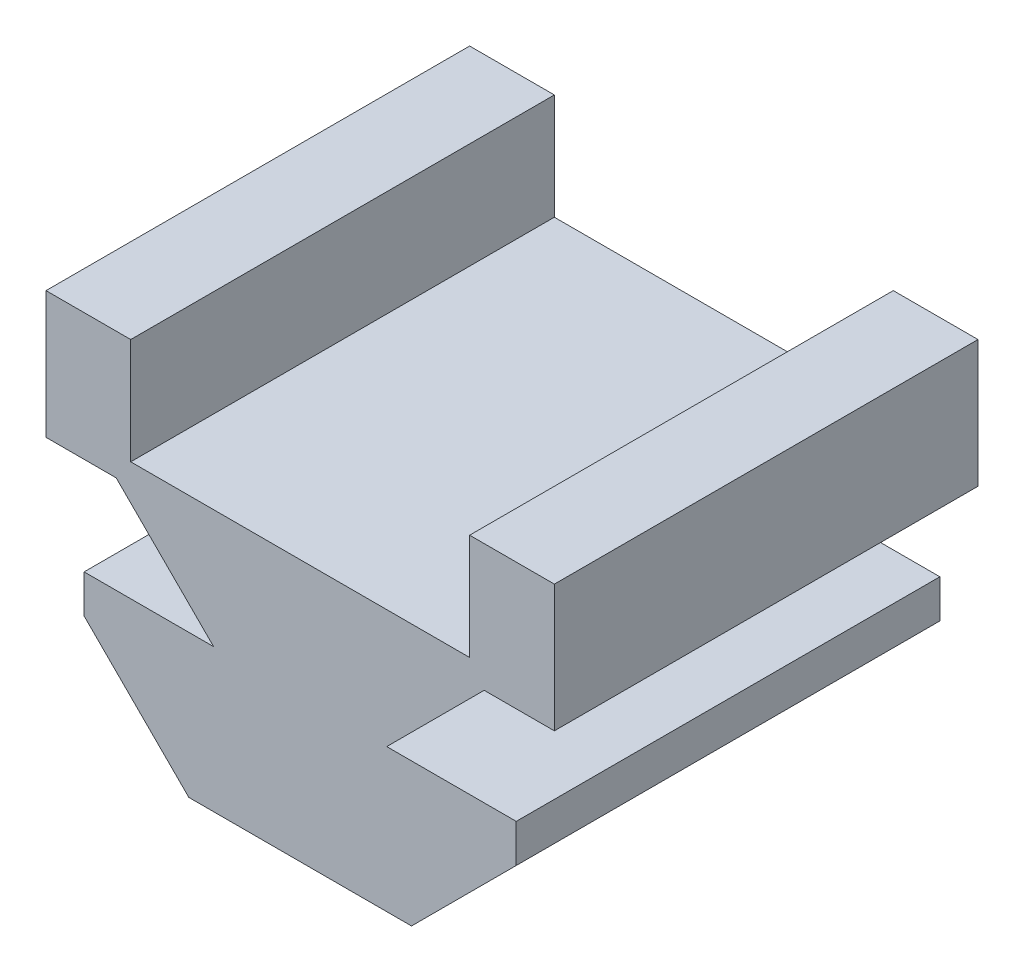
ISO-10303-21;
HEADER;
FILE_DESCRIPTION(('STEP AP214'),'2;1');
FILE_NAME('part.step','',(''),(''),'','','');
FILE_SCHEMA(('AUTOMOTIVE_DESIGN { 1 0 10303 214 1 1 1 1 }'));
ENDSEC;
DATA;
#1=APPLICATION_CONTEXT('core data for automotive mechanical design processes');
#2=APPLICATION_PROTOCOL_DEFINITION('international standard','automotive_design',2000,#1);
#3=PRODUCT_CONTEXT('',#1,'mechanical');
#4=PRODUCT('Part','Part','',(#3));
#5=PRODUCT_RELATED_PRODUCT_CATEGORY('part','',(#4));
#6=PRODUCT_DEFINITION_FORMATION('','',#4);
#7=PRODUCT_DEFINITION_CONTEXT('part definition',#1,'design');
#8=PRODUCT_DEFINITION('design','',#6,#7);
#9=PRODUCT_DEFINITION_SHAPE('','',#8);
#10=(LENGTH_UNIT() NAMED_UNIT(*) SI_UNIT(.MILLI.,.METRE.));
#11=(NAMED_UNIT(*) PLANE_ANGLE_UNIT() SI_UNIT($,.RADIAN.));
#12=(NAMED_UNIT(*) SI_UNIT($,.STERADIAN.) SOLID_ANGLE_UNIT());
#13=UNCERTAINTY_MEASURE_WITH_UNIT(LENGTH_MEASURE(1.E-05),#10,'distance_accuracy_value','');
#14=(GEOMETRIC_REPRESENTATION_CONTEXT(3) GLOBAL_UNCERTAINTY_ASSIGNED_CONTEXT((#13)) GLOBAL_UNIT_ASSIGNED_CONTEXT((#10,
#11,#12)) REPRESENTATION_CONTEXT('',''));
#15=CARTESIAN_POINT('',(0.,0.,0.));
#16=DIRECTION('',(0.,0.,1.));
#17=DIRECTION('',(1.,0.,0.));
#18=AXIS2_PLACEMENT_3D('',#15,#16,#17);
#19=CARTESIAN_POINT('',(4.00000000000002,0.,10.));
#20=DIRECTION('',(-1.,0.,0.));
#21=DIRECTION('',(0.,0.,1.));
#22=AXIS2_PLACEMENT_3D('',#19,#20,#21);
#23=PLANE('',#22);
#24=DIRECTION('',(0.,1.,0.));
#25=VECTOR('',#24,1.);
#26=CARTESIAN_POINT('',(4.00000000000002,0.,0.));
#27=LINE('',#26,#25);
#28=CARTESIAN_POINT('',(4.00000000000002,0.,0.));
#29=VERTEX_POINT('',#28);
#30=CARTESIAN_POINT('',(4.00000000000002,3.00000000000007,0.));
#31=VERTEX_POINT('',#30);
#32=EDGE_CURVE('E201',#29,#31,#27,.T.);
#33=ORIENTED_EDGE('',*,*,#32,.F.);
#34=DIRECTION('',(0.,0.,-1.));
#35=VECTOR('',#34,1.);
#36=CARTESIAN_POINT('',(4.00000000000002,0.,10.));
#37=LINE('',#36,#35);
#38=CARTESIAN_POINT('',(4.00000000000002,0.,10.));
#39=VERTEX_POINT('',#38);
#40=EDGE_CURVE('E11',#39,#29,#37,.T.);
#41=ORIENTED_EDGE('',*,*,#40,.F.);
#42=DIRECTION('',(0.,1.,0.));
#43=VECTOR('',#42,1.);
#44=CARTESIAN_POINT('',(4.00000000000002,0.,10.));
#45=LINE('',#44,#43);
#46=CARTESIAN_POINT('',(4.00000000000002,3.00000000000007,10.));
#47=VERTEX_POINT('',#46);
#48=EDGE_CURVE('E264',#39,#47,#45,.T.);
#49=ORIENTED_EDGE('',*,*,#48,.T.);
#50=DIRECTION('',(0.,0.,-1.));
#51=VECTOR('',#50,1.);
#52=CARTESIAN_POINT('',(4.00000000000002,3.00000000000007,10.));
#53=LINE('',#52,#51);
#54=EDGE_CURVE('E122',#47,#31,#53,.T.);
#55=ORIENTED_EDGE('',*,*,#54,.T.);
#56=EDGE_LOOP('',(#33,#41,#49,#55));
#57=FACE_BOUND('',#56,.T.);
#58=ADVANCED_FACE('F41',(#57),#23,.T.);
#59=CARTESIAN_POINT('',(0.,0.,10.));
#60=DIRECTION('',(0.,-1.,0.));
#61=DIRECTION('',(1.,0.,0.));
#62=AXIS2_PLACEMENT_3D('',#59,#60,#61);
#63=PLANE('',#62);
#64=DIRECTION('',(-1.,0.,0.));
#65=VECTOR('',#64,1.);
#66=CARTESIAN_POINT('',(0.,0.,0.));
#67=LINE('',#66,#65);
#68=CARTESIAN_POINT('',(5.65710678118656,0.,0.));
#69=VERTEX_POINT('',#68);
#70=EDGE_CURVE('E205',#69,#29,#67,.T.);
#71=ORIENTED_EDGE('',*,*,#70,.F.);
#72=DIRECTION('',(0.,0.,-1.));
#73=VECTOR('',#72,1.);
#74=CARTESIAN_POINT('',(5.65710678118656,0.,10.));
#75=LINE('',#74,#73);
#76=CARTESIAN_POINT('',(5.65710678118656,0.,10.));
#77=VERTEX_POINT('',#76);
#78=EDGE_CURVE('E50',#77,#69,#75,.T.);
#79=ORIENTED_EDGE('',*,*,#78,.F.);
#80=DIRECTION('',(-1.,0.,0.));
#81=VECTOR('',#80,1.);
#82=CARTESIAN_POINT('',(0.,0.,10.));
#83=LINE('',#82,#81);
#84=EDGE_CURVE('E332',#77,#39,#83,.T.);
#85=ORIENTED_EDGE('',*,*,#84,.T.);
#86=ORIENTED_EDGE('',*,*,#40,.T.);
#87=EDGE_LOOP('',(#71,#79,#85,#86));
#88=FACE_BOUND('',#87,.T.);
#89=ADVANCED_FACE('F321',(#88),#63,.T.);
#90=CARTESIAN_POINT('',(2.82855339059332,2.82855339059331,10.));
#91=DIRECTION('',(-0.707106781186548,-0.707106781186547,0.));
#92=DIRECTION('',(0.707106781186547,-0.707106781186548,0.));
#93=AXIS2_PLACEMENT_3D('',#90,#91,#92);
#94=PLANE('',#93);
#95=DIRECTION('',(-0.707106781186547,0.707106781186548,0.));
#96=VECTOR('',#95,1.);
#97=CARTESIAN_POINT('',(2.82855339059332,2.82855339059331,0.));
#98=LINE('',#97,#96);
#99=CARTESIAN_POINT('',(7.95710678118658,-2.29999999999996,0.));
#100=VERTEX_POINT('',#99);
#101=EDGE_CURVE('E209',#100,#69,#98,.T.);
#102=ORIENTED_EDGE('',*,*,#101,.F.);
#103=DIRECTION('',(0.,0.,-1.));
#104=VECTOR('',#103,1.);
#105=CARTESIAN_POINT('',(7.95710678118658,-2.29999999999996,10.));
#106=LINE('',#105,#104);
#107=CARTESIAN_POINT('',(7.95710678118658,-2.29999999999996,10.));
#108=VERTEX_POINT('',#107);
#109=EDGE_CURVE('E308',#108,#100,#106,.T.);
#110=ORIENTED_EDGE('',*,*,#109,.F.);
#111=DIRECTION('',(-0.707106781186547,0.707106781186548,0.));
#112=VECTOR('',#111,1.);
#113=CARTESIAN_POINT('',(2.82855339059332,2.82855339059331,10.));
#114=LINE('',#113,#112);
#115=EDGE_CURVE('E317',#108,#77,#114,.T.);
#116=ORIENTED_EDGE('',*,*,#115,.T.);
#117=ORIENTED_EDGE('',*,*,#78,.T.);
#118=EDGE_LOOP('',(#102,#110,#116,#117));
#119=FACE_BOUND('',#118,.T.);
#120=ADVANCED_FACE('F315',(#119),#94,.T.);
#121=CARTESIAN_POINT('',(0.,-2.29999999999996,10.));
#122=DIRECTION('',(0.,1.,0.));
#123=DIRECTION('',(0.,0.,1.));
#124=AXIS2_PLACEMENT_3D('',#121,#122,#123);
#125=PLANE('',#124);
#126=DIRECTION('',(1.,0.,0.));
#127=VECTOR('',#126,1.);
#128=CARTESIAN_POINT('',(0.,-2.29999999999996,0.));
#129=LINE('',#128,#127);
#130=CARTESIAN_POINT('',(4.90000000000005,-2.29999999999996,0.));
#131=VERTEX_POINT('',#130);
#132=EDGE_CURVE('E213',#131,#100,#129,.T.);
#133=ORIENTED_EDGE('',*,*,#132,.F.);
#134=DIRECTION('',(0.,0.,-1.));
#135=VECTOR('',#134,1.);
#136=CARTESIAN_POINT('',(4.90000000000005,-2.29999999999996,10.));
#137=LINE('',#136,#135);
#138=CARTESIAN_POINT('',(4.90000000000005,-2.29999999999996,10.));
#139=VERTEX_POINT('',#138);
#140=EDGE_CURVE('E305',#139,#131,#137,.T.);
#141=ORIENTED_EDGE('',*,*,#140,.F.);
#142=DIRECTION('',(1.,0.,0.));
#143=VECTOR('',#142,1.);
#144=CARTESIAN_POINT('',(0.,-2.29999999999996,10.));
#145=LINE('',#144,#143);
#146=EDGE_CURVE('E331',#139,#108,#145,.T.);
#147=ORIENTED_EDGE('',*,*,#146,.T.);
#148=ORIENTED_EDGE('',*,*,#109,.T.);
#149=EDGE_LOOP('',(#133,#141,#147,#148));
#150=FACE_BOUND('',#149,.T.);
#151=ADVANCED_FACE('F327',(#150),#125,.T.);
#152=CARTESIAN_POINT('',(4.90000000000005,0.,10.));
#153=DIRECTION('',(1.,0.,0.));
#154=DIRECTION('',(0.,0.,-1.));
#155=AXIS2_PLACEMENT_3D('',#152,#153,#154);
#156=PLANE('',#155);
#157=DIRECTION('',(0.,-1.,0.));
#158=VECTOR('',#157,1.);
#159=CARTESIAN_POINT('',(4.90000000000005,0.,0.));
#160=LINE('',#159,#158);
#161=CARTESIAN_POINT('',(4.90000000000005,-3.20294372515229,0.));
#162=VERTEX_POINT('',#161);
#163=EDGE_CURVE('E217',#131,#162,#160,.T.);
#164=ORIENTED_EDGE('',*,*,#163,.T.);
#165=DIRECTION('',(0.,0.,-1.));
#166=VECTOR('',#165,1.);
#167=CARTESIAN_POINT('',(4.90000000000005,-3.20294372515229,10.));
#168=LINE('',#167,#166);
#169=CARTESIAN_POINT('',(4.90000000000005,-3.20294372515229,10.));
#170=VERTEX_POINT('',#169);
#171=EDGE_CURVE('E302',#170,#162,#168,.T.);
#172=ORIENTED_EDGE('',*,*,#171,.F.);
#173=DIRECTION('',(0.,-1.,0.));
#174=VECTOR('',#173,1.);
#175=CARTESIAN_POINT('',(4.90000000000005,0.,10.));
#176=LINE('',#175,#174);
#177=EDGE_CURVE('E337',#139,#170,#176,.T.);
#178=ORIENTED_EDGE('',*,*,#177,.F.);
#179=ORIENTED_EDGE('',*,*,#140,.T.);
#180=EDGE_LOOP('',(#164,#172,#178,#179));
#181=FACE_BOUND('',#180,.T.);
#182=ADVANCED_FACE('F394',(#181),#156,.F.);
#183=CARTESIAN_POINT('',(0.848528137423882,0.848528137423882,10.));
#184=DIRECTION('',(-0.707106781186548,-0.707106781186548,0.));
#185=DIRECTION('',(0.707106781186548,-0.707106781186548,0.));
#186=AXIS2_PLACEMENT_3D('',#183,#184,#185);
#187=PLANE('',#186);
#188=DIRECTION('',(-0.707106781186548,0.707106781186548,0.));
#189=VECTOR('',#188,1.);
#190=CARTESIAN_POINT('',(0.848528137423882,0.848528137423882,0.));
#191=LINE('',#190,#189);
#192=CARTESIAN_POINT('',(7.37205627484774,-5.67499999999998,0.));
#193=VERTEX_POINT('',#192);
#194=EDGE_CURVE('E221',#193,#162,#191,.T.);
#195=ORIENTED_EDGE('',*,*,#194,.F.);
#196=DIRECTION('',(0.,0.,-1.));
#197=VECTOR('',#196,1.);
#198=CARTESIAN_POINT('',(7.37205627484774,-5.67499999999998,10.));
#199=LINE('',#198,#197);
#200=CARTESIAN_POINT('',(7.37205627484774,-5.67499999999998,10.));
#201=VERTEX_POINT('',#200);
#202=EDGE_CURVE('E299',#201,#193,#199,.T.);
#203=ORIENTED_EDGE('',*,*,#202,.F.);
#204=DIRECTION('',(-0.707106781186548,0.707106781186548,0.));
#205=VECTOR('',#204,1.);
#206=CARTESIAN_POINT('',(0.848528137423882,0.848528137423882,10.));
#207=LINE('',#206,#205);
#208=EDGE_CURVE('E344',#201,#170,#207,.T.);
#209=ORIENTED_EDGE('',*,*,#208,.T.);
#210=ORIENTED_EDGE('',*,*,#171,.T.);
#211=EDGE_LOOP('',(#195,#203,#209,#210));
#212=FACE_BOUND('',#211,.T.);
#213=ADVANCED_FACE('F397',(#212),#187,.T.);
#214=CARTESIAN_POINT('',(0.,-5.675,10.));
#215=DIRECTION('',(0.,1.,0.));
#216=DIRECTION('',(-1.,0.,0.));
#217=AXIS2_PLACEMENT_3D('',#214,#215,#216);
#218=PLANE('',#217);
#219=DIRECTION('',(1.,0.,0.));
#220=VECTOR('',#219,1.);
#221=CARTESIAN_POINT('',(0.,-5.675,0.));
#222=LINE('',#221,#220);
#223=CARTESIAN_POINT('',(12.6279437251523,-5.67499999999996,0.));
#224=VERTEX_POINT('',#223);
#225=EDGE_CURVE('E225',#193,#224,#222,.T.);
#226=ORIENTED_EDGE('',*,*,#225,.T.);
#227=DIRECTION('',(0.,0.,-1.));
#228=VECTOR('',#227,1.);
#229=CARTESIAN_POINT('',(12.6279437251523,-5.67499999999996,10.));
#230=LINE('',#229,#228);
#231=CARTESIAN_POINT('',(12.6279437251523,-5.67499999999996,10.));
#232=VERTEX_POINT('',#231);
#233=EDGE_CURVE('E295',#232,#224,#230,.T.);
#234=ORIENTED_EDGE('',*,*,#233,.F.);
#235=DIRECTION('',(1.,0.,0.));
#236=VECTOR('',#235,1.);
#237=CARTESIAN_POINT('',(0.,-5.675,10.));
#238=LINE('',#237,#236);
#239=EDGE_CURVE('E348',#201,#232,#238,.T.);
#240=ORIENTED_EDGE('',*,*,#239,.F.);
#241=ORIENTED_EDGE('',*,*,#202,.T.);
#242=EDGE_LOOP('',(#226,#234,#240,#241));
#243=FACE_BOUND('',#242,.T.);
#244=ADVANCED_FACE('F401',(#243),#218,.F.);
#245=CARTESIAN_POINT('',(9.15147186257619,-9.15147186257612,10.));
#246=DIRECTION('',(-0.707106781186551,0.707106781186545,0.));
#247=DIRECTION('',(-0.707106781186545,-0.707106781186551,0.));
#248=AXIS2_PLACEMENT_3D('',#245,#246,#247);
#249=PLANE('',#248);
#250=DIRECTION('',(0.707106781186545,0.707106781186551,0.));
#251=VECTOR('',#250,1.);
#252=CARTESIAN_POINT('',(9.15147186257619,-9.15147186257612,0.));
#253=LINE('',#252,#251);
#254=CARTESIAN_POINT('',(15.1,-3.20294372515226,0.));
#255=VERTEX_POINT('',#254);
#256=EDGE_CURVE('E228',#224,#255,#253,.T.);
#257=ORIENTED_EDGE('',*,*,#256,.T.);
#258=DIRECTION('',(0.,0.,-1.));
#259=VECTOR('',#258,1.);
#260=CARTESIAN_POINT('',(15.1,-3.20294372515226,10.));
#261=LINE('',#260,#259);
#262=CARTESIAN_POINT('',(15.1,-3.20294372515226,10.));
#263=VERTEX_POINT('',#262);
#264=EDGE_CURVE('E292',#263,#255,#261,.T.);
#265=ORIENTED_EDGE('',*,*,#264,.F.);
#266=DIRECTION('',(0.707106781186545,0.707106781186551,0.));
#267=VECTOR('',#266,1.);
#268=CARTESIAN_POINT('',(9.15147186257619,-9.15147186257612,10.));
#269=LINE('',#268,#267);
#270=EDGE_CURVE('E351',#232,#263,#269,.T.);
#271=ORIENTED_EDGE('',*,*,#270,.F.);
#272=ORIENTED_EDGE('',*,*,#233,.T.);
#273=EDGE_LOOP('',(#257,#265,#271,#272));
#274=FACE_BOUND('',#273,.T.);
#275=ADVANCED_FACE('F405',(#274),#249,.F.);
#276=CARTESIAN_POINT('',(15.1,0.,10.));
#277=DIRECTION('',(1.,0.,0.));
#278=DIRECTION('',(0.,1.,0.));
#279=AXIS2_PLACEMENT_3D('',#276,#277,#278);
#280=PLANE('',#279);
#281=DIRECTION('',(0.,-1.,0.));
#282=VECTOR('',#281,1.);
#283=CARTESIAN_POINT('',(15.1,0.,0.));
#284=LINE('',#283,#282);
#285=CARTESIAN_POINT('',(15.1,-2.29999999999993,0.));
#286=VERTEX_POINT('',#285);
#287=EDGE_CURVE('E232',#286,#255,#284,.T.);
#288=ORIENTED_EDGE('',*,*,#287,.F.);
#289=DIRECTION('',(0.,0.,-1.));
#290=VECTOR('',#289,1.);
#291=CARTESIAN_POINT('',(15.1,-2.29999999999993,10.));
#292=LINE('',#291,#290);
#293=CARTESIAN_POINT('',(15.1,-2.29999999999993,10.));
#294=VERTEX_POINT('',#293);
#295=EDGE_CURVE('E289',#294,#286,#292,.T.);
#296=ORIENTED_EDGE('',*,*,#295,.F.);
#297=DIRECTION('',(0.,-1.,0.));
#298=VECTOR('',#297,1.);
#299=CARTESIAN_POINT('',(15.1,0.,10.));
#300=LINE('',#299,#298);
#301=EDGE_CURVE('E354',#294,#263,#300,.T.);
#302=ORIENTED_EDGE('',*,*,#301,.T.);
#303=ORIENTED_EDGE('',*,*,#264,.T.);
#304=EDGE_LOOP('',(#288,#296,#302,#303));
#305=FACE_BOUND('',#304,.T.);
#306=ADVANCED_FACE('F409',(#305),#280,.T.);
#307=CARTESIAN_POINT('',(0.,-2.3,10.));
#308=DIRECTION('',(0.,-1.,0.));
#309=DIRECTION('',(1.,0.,0.));
#310=AXIS2_PLACEMENT_3D('',#307,#308,#309);
#311=PLANE('',#310);
#312=DIRECTION('',(-1.,0.,0.));
#313=VECTOR('',#312,1.);
#314=CARTESIAN_POINT('',(0.,-2.3,0.));
#315=LINE('',#314,#313);
#316=CARTESIAN_POINT('',(12.0428932188135,-2.29999999999995,0.));
#317=VERTEX_POINT('',#316);
#318=EDGE_CURVE('E236',#286,#317,#315,.T.);
#319=ORIENTED_EDGE('',*,*,#318,.T.);
#320=DIRECTION('',(0.,0.,-1.));
#321=VECTOR('',#320,1.);
#322=CARTESIAN_POINT('',(12.0428932188135,-2.29999999999995,10.));
#323=LINE('',#322,#321);
#324=CARTESIAN_POINT('',(12.0428932188135,-2.29999999999995,10.));
#325=VERTEX_POINT('',#324);
#326=EDGE_CURVE('E285',#325,#317,#323,.T.);
#327=ORIENTED_EDGE('',*,*,#326,.F.);
#328=DIRECTION('',(-1.,0.,0.));
#329=VECTOR('',#328,1.);
#330=CARTESIAN_POINT('',(0.,-2.3,10.));
#331=LINE('',#330,#329);
#332=EDGE_CURVE('E358',#294,#325,#331,.T.);
#333=ORIENTED_EDGE('',*,*,#332,.F.);
#334=ORIENTED_EDGE('',*,*,#295,.T.);
#335=EDGE_LOOP('',(#319,#327,#333,#334));
#336=FACE_BOUND('',#335,.T.);
#337=ADVANCED_FACE('F413',(#336),#311,.F.);
#338=CARTESIAN_POINT('',(7.17144660940677,-7.1714466094067,10.));
#339=DIRECTION('',(-0.707106781186551,0.707106781186544,0.));
#340=DIRECTION('',(-0.707106781186544,-0.707106781186551,0.));
#341=AXIS2_PLACEMENT_3D('',#338,#339,#340);
#342=PLANE('',#341);
#343=DIRECTION('',(0.707106781186544,0.707106781186551,0.));
#344=VECTOR('',#343,1.);
#345=CARTESIAN_POINT('',(7.17144660940677,-7.1714466094067,0.));
#346=LINE('',#345,#344);
#347=CARTESIAN_POINT('',(14.3428932188135,0.,0.));
#348=VERTEX_POINT('',#347);
#349=EDGE_CURVE('E239',#317,#348,#346,.T.);
#350=ORIENTED_EDGE('',*,*,#349,.T.);
#351=DIRECTION('',(0.,0.,-1.));
#352=VECTOR('',#351,1.);
#353=CARTESIAN_POINT('',(14.3428932188135,0.,10.));
#354=LINE('',#353,#352);
#355=CARTESIAN_POINT('',(14.3428932188135,0.,10.));
#356=VERTEX_POINT('',#355);
#357=EDGE_CURVE('E281',#356,#348,#354,.T.);
#358=ORIENTED_EDGE('',*,*,#357,.F.);
#359=DIRECTION('',(0.707106781186544,0.707106781186551,0.));
#360=VECTOR('',#359,1.);
#361=CARTESIAN_POINT('',(7.17144660940677,-7.1714466094067,10.));
#362=LINE('',#361,#360);
#363=EDGE_CURVE('E361',#325,#356,#362,.T.);
#364=ORIENTED_EDGE('',*,*,#363,.F.);
#365=ORIENTED_EDGE('',*,*,#326,.T.);
#366=EDGE_LOOP('',(#350,#358,#364,#365));
#367=FACE_BOUND('',#366,.T.);
#368=ADVANCED_FACE('F417',(#367),#342,.F.);
#369=CARTESIAN_POINT('',(0.,0.,10.));
#370=DIRECTION('',(0.,1.,0.));
#371=DIRECTION('',(-1.,0.,0.));
#372=AXIS2_PLACEMENT_3D('',#369,#370,#371);
#373=PLANE('',#372);
#374=DIRECTION('',(1.,0.,0.));
#375=VECTOR('',#374,1.);
#376=CARTESIAN_POINT('',(0.,0.,0.));
#377=LINE('',#376,#375);
#378=CARTESIAN_POINT('',(16.,0.,0.));
#379=VERTEX_POINT('',#378);
#380=EDGE_CURVE('E242',#348,#379,#377,.T.);
#381=ORIENTED_EDGE('',*,*,#380,.T.);
#382=DIRECTION('',(0.,0.,-1.));
#383=VECTOR('',#382,1.);
#384=CARTESIAN_POINT('',(16.,0.,10.));
#385=LINE('',#384,#383);
#386=CARTESIAN_POINT('',(16.,0.,10.));
#387=VERTEX_POINT('',#386);
#388=EDGE_CURVE('E277',#387,#379,#385,.T.);
#389=ORIENTED_EDGE('',*,*,#388,.F.);
#390=DIRECTION('',(1.,0.,0.));
#391=VECTOR('',#390,1.);
#392=CARTESIAN_POINT('',(0.,0.,10.));
#393=LINE('',#392,#391);
#394=EDGE_CURVE('E364',#356,#387,#393,.T.);
#395=ORIENTED_EDGE('',*,*,#394,.F.);
#396=ORIENTED_EDGE('',*,*,#357,.T.);
#397=EDGE_LOOP('',(#381,#389,#395,#396));
#398=FACE_BOUND('',#397,.T.);
#399=ADVANCED_FACE('F421',(#398),#373,.F.);
#400=CARTESIAN_POINT('',(16.,0.,10.));
#401=DIRECTION('',(-1.,0.,0.));
#402=DIRECTION('',(0.,-1.,0.));
#403=AXIS2_PLACEMENT_3D('',#400,#401,#402);
#404=PLANE('',#403);
#405=DIRECTION('',(0.,1.,0.));
#406=VECTOR('',#405,1.);
#407=CARTESIAN_POINT('',(16.,0.,0.));
#408=LINE('',#407,#406);
#409=CARTESIAN_POINT('',(16.,3.0000000000001,0.));
#410=VERTEX_POINT('',#409);
#411=EDGE_CURVE('E245',#379,#410,#408,.T.);
#412=ORIENTED_EDGE('',*,*,#411,.T.);
#413=DIRECTION('',(0.,0.,-1.));
#414=VECTOR('',#413,1.);
#415=CARTESIAN_POINT('',(16.,3.0000000000001,10.));
#416=LINE('',#415,#414);
#417=CARTESIAN_POINT('',(16.,3.0000000000001,10.));
#418=VERTEX_POINT('',#417);
#419=EDGE_CURVE('E274',#418,#410,#416,.T.);
#420=ORIENTED_EDGE('',*,*,#419,.F.);
#421=DIRECTION('',(0.,1.,0.));
#422=VECTOR('',#421,1.);
#423=CARTESIAN_POINT('',(16.,0.,10.));
#424=LINE('',#423,#422);
#425=EDGE_CURVE('E367',#387,#418,#424,.T.);
#426=ORIENTED_EDGE('',*,*,#425,.F.);
#427=ORIENTED_EDGE('',*,*,#388,.T.);
#428=EDGE_LOOP('',(#412,#420,#426,#427));
#429=FACE_BOUND('',#428,.T.);
#430=ADVANCED_FACE('F425',(#429),#404,.F.);
#431=CARTESIAN_POINT('',(0.,3.00000000000003,10.));
#432=DIRECTION('',(0.,1.,0.));
#433=DIRECTION('',(-1.,0.,0.));
#434=AXIS2_PLACEMENT_3D('',#431,#432,#433);
#435=PLANE('',#434);
#436=DIRECTION('',(1.,0.,0.));
#437=VECTOR('',#436,1.);
#438=CARTESIAN_POINT('',(0.,3.00000000000003,0.));
#439=LINE('',#438,#437);
#440=CARTESIAN_POINT('',(14.,3.00000000000009,0.));
#441=VERTEX_POINT('',#440);
#442=EDGE_CURVE('E249',#441,#410,#439,.T.);
#443=ORIENTED_EDGE('',*,*,#442,.F.);
#444=DIRECTION('',(0.,0.,-1.));
#445=VECTOR('',#444,1.);
#446=CARTESIAN_POINT('',(14.,3.00000000000009,10.));
#447=LINE('',#446,#445);
#448=CARTESIAN_POINT('',(14.,3.00000000000009,10.));
#449=VERTEX_POINT('',#448);
#450=EDGE_CURVE('E271',#449,#441,#447,.T.);
#451=ORIENTED_EDGE('',*,*,#450,.F.);
#452=DIRECTION('',(1.,0.,0.));
#453=VECTOR('',#452,1.);
#454=CARTESIAN_POINT('',(0.,3.00000000000003,10.));
#455=LINE('',#454,#453);
#456=EDGE_CURVE('E195',#449,#418,#455,.T.);
#457=ORIENTED_EDGE('',*,*,#456,.T.);
#458=ORIENTED_EDGE('',*,*,#419,.T.);
#459=EDGE_LOOP('',(#443,#451,#457,#458));
#460=FACE_BOUND('',#459,.T.);
#461=ADVANCED_FACE('F373',(#460),#435,.T.);
#462=CARTESIAN_POINT('',(14.,0.,10.));
#463=DIRECTION('',(-1.,0.,0.));
#464=DIRECTION('',(0.,-1.,0.));
#465=AXIS2_PLACEMENT_3D('',#462,#463,#464);
#466=PLANE('',#465);
#467=DIRECTION('',(0.,1.,0.));
#468=VECTOR('',#467,1.);
#469=CARTESIAN_POINT('',(14.,0.,0.));
#470=LINE('',#469,#468);
#471=CARTESIAN_POINT('',(14.,0.50000000000006,0.));
#472=VERTEX_POINT('',#471);
#473=EDGE_CURVE('E253',#472,#441,#470,.T.);
#474=ORIENTED_EDGE('',*,*,#473,.F.);
#475=DIRECTION('',(0.,0.,-1.));
#476=VECTOR('',#475,1.);
#477=CARTESIAN_POINT('',(14.,0.50000000000006,10.));
#478=LINE('',#477,#476);
#479=CARTESIAN_POINT('',(14.,0.50000000000006,10.));
#480=VERTEX_POINT('',#479);
#481=EDGE_CURVE('E180',#480,#472,#478,.T.);
#482=ORIENTED_EDGE('',*,*,#481,.F.);
#483=DIRECTION('',(0.,1.,0.));
#484=VECTOR('',#483,1.);
#485=CARTESIAN_POINT('',(14.,0.,10.));
#486=LINE('',#485,#484);
#487=EDGE_CURVE('E191',#480,#449,#486,.T.);
#488=ORIENTED_EDGE('',*,*,#487,.T.);
#489=ORIENTED_EDGE('',*,*,#450,.T.);
#490=EDGE_LOOP('',(#474,#482,#488,#489));
#491=FACE_BOUND('',#490,.T.);
#492=ADVANCED_FACE('F378',(#491),#466,.T.);
#493=CARTESIAN_POINT('',(0.,0.500000000000027,10.));
#494=DIRECTION('',(0.,1.,0.));
#495=DIRECTION('',(-1.,0.,0.));
#496=AXIS2_PLACEMENT_3D('',#493,#494,#495);
#497=PLANE('',#496);
#498=DIRECTION('',(1.,0.,0.));
#499=VECTOR('',#498,1.);
#500=CARTESIAN_POINT('',(0.,0.500000000000027,0.));
#501=LINE('',#500,#499);
#502=CARTESIAN_POINT('',(6.00000000000003,0.500000000000041,0.));
#503=VERTEX_POINT('',#502);
#504=EDGE_CURVE('E178',#503,#472,#501,.T.);
#505=ORIENTED_EDGE('',*,*,#504,.F.);
#506=DIRECTION('',(0.,0.,-1.));
#507=VECTOR('',#506,1.);
#508=CARTESIAN_POINT('',(6.00000000000003,0.500000000000041,10.));
#509=LINE('',#508,#507);
#510=CARTESIAN_POINT('',(6.00000000000003,0.500000000000041,10.));
#511=VERTEX_POINT('',#510);
#512=EDGE_CURVE('E172',#511,#503,#509,.T.);
#513=ORIENTED_EDGE('',*,*,#512,.F.);
#514=DIRECTION('',(1.,0.,0.));
#515=VECTOR('',#514,1.);
#516=CARTESIAN_POINT('',(0.,0.500000000000027,10.));
#517=LINE('',#516,#515);
#518=EDGE_CURVE('E176',#511,#480,#517,.T.);
#519=ORIENTED_EDGE('',*,*,#518,.T.);
#520=ORIENTED_EDGE('',*,*,#481,.T.);
#521=EDGE_LOOP('',(#505,#513,#519,#520));
#522=FACE_BOUND('',#521,.T.);
#523=ADVANCED_FACE('F174',(#522),#497,.T.);
#524=CARTESIAN_POINT('',(6.00000000000004,0.,10.));
#525=DIRECTION('',(-1.,0.,0.));
#526=DIRECTION('',(0.,-1.,0.));
#527=AXIS2_PLACEMENT_3D('',#524,#525,#526);
#528=PLANE('',#527);
#529=DIRECTION('',(0.,1.,0.));
#530=VECTOR('',#529,1.);
#531=CARTESIAN_POINT('',(6.00000000000004,0.,0.));
#532=LINE('',#531,#530);
#533=CARTESIAN_POINT('',(6.00000000000002,3.00000000000007,0.));
#534=VERTEX_POINT('',#533);
#535=EDGE_CURVE('E115',#503,#534,#532,.T.);
#536=ORIENTED_EDGE('',*,*,#535,.T.);
#537=DIRECTION('',(0.,0.,-1.));
#538=VECTOR('',#537,1.);
#539=CARTESIAN_POINT('',(6.00000000000002,3.00000000000007,10.));
#540=LINE('',#539,#538);
#541=CARTESIAN_POINT('',(6.00000000000002,3.00000000000007,10.));
#542=VERTEX_POINT('',#541);
#543=EDGE_CURVE('E181',#542,#534,#540,.T.);
#544=ORIENTED_EDGE('',*,*,#543,.F.);
#545=DIRECTION('',(0.,1.,0.));
#546=VECTOR('',#545,1.);
#547=CARTESIAN_POINT('',(6.00000000000004,0.,10.));
#548=LINE('',#547,#546);
#549=EDGE_CURVE('E183',#511,#542,#548,.T.);
#550=ORIENTED_EDGE('',*,*,#549,.F.);
#551=ORIENTED_EDGE('',*,*,#512,.T.);
#552=EDGE_LOOP('',(#536,#544,#550,#551));
#553=FACE_BOUND('',#552,.T.);
#554=ADVANCED_FACE('F184',(#553),#528,.F.);
#555=CARTESIAN_POINT('',(0.,3.00000000000007,10.));
#556=DIRECTION('',(0.,-1.,0.));
#557=DIRECTION('',(1.,0.,0.));
#558=AXIS2_PLACEMENT_3D('',#555,#556,#557);
#559=PLANE('',#558);
#560=DIRECTION('',(-1.,0.,0.));
#561=VECTOR('',#560,1.);
#562=CARTESIAN_POINT('',(0.,3.00000000000007,0.));
#563=LINE('',#562,#561);
#564=EDGE_CURVE('E261',#534,#31,#563,.T.);
#565=ORIENTED_EDGE('',*,*,#564,.T.);
#566=ORIENTED_EDGE('',*,*,#54,.F.);
#567=DIRECTION('',(-1.,0.,0.));
#568=VECTOR('',#567,1.);
#569=CARTESIAN_POINT('',(0.,3.00000000000007,10.));
#570=LINE('',#569,#568);
#571=EDGE_CURVE('E58',#542,#47,#570,.T.);
#572=ORIENTED_EDGE('',*,*,#571,.F.);
#573=ORIENTED_EDGE('',*,*,#543,.T.);
#574=EDGE_LOOP('',(#565,#566,#572,#573));
#575=FACE_BOUND('',#574,.T.);
#576=ADVANCED_FACE('F381',(#575),#559,.F.);
#577=CARTESIAN_POINT('',(0.,0.,10.));
#578=DIRECTION('',(0.,0.,1.));
#579=DIRECTION('',(1.,0.,0.));
#580=AXIS2_PLACEMENT_3D('',#577,#578,#579);
#581=PLANE('',#580);
#582=ORIENTED_EDGE('',*,*,#48,.F.);
#583=ORIENTED_EDGE('',*,*,#84,.F.);
#584=ORIENTED_EDGE('',*,*,#115,.F.);
#585=ORIENTED_EDGE('',*,*,#146,.F.);
#586=ORIENTED_EDGE('',*,*,#177,.T.);
#587=ORIENTED_EDGE('',*,*,#208,.F.);
#588=ORIENTED_EDGE('',*,*,#239,.T.);
#589=ORIENTED_EDGE('',*,*,#270,.T.);
#590=ORIENTED_EDGE('',*,*,#301,.F.);
#591=ORIENTED_EDGE('',*,*,#332,.T.);
#592=ORIENTED_EDGE('',*,*,#363,.T.);
#593=ORIENTED_EDGE('',*,*,#394,.T.);
#594=ORIENTED_EDGE('',*,*,#425,.T.);
#595=ORIENTED_EDGE('',*,*,#456,.F.);
#596=ORIENTED_EDGE('',*,*,#487,.F.);
#597=ORIENTED_EDGE('',*,*,#518,.F.);
#598=ORIENTED_EDGE('',*,*,#549,.T.);
#599=ORIENTED_EDGE('',*,*,#571,.T.);
#600=EDGE_LOOP('',(#582,#583,#584,#585,#586,#587,#588,#589,#590,#591,#592,#593,#594,#595,#596,
#597,#598,#599));
#601=FACE_BOUND('',#600,.T.);
#602=ADVANCED_FACE('F188',(#601),#581,.T.);
#603=CARTESIAN_POINT('',(0.,0.,0.));
#604=DIRECTION('',(0.,0.,1.));
#605=DIRECTION('',(1.,0.,0.));
#606=AXIS2_PLACEMENT_3D('',#603,#604,#605);
#607=PLANE('',#606);
#608=ORIENTED_EDGE('',*,*,#32,.T.);
#609=ORIENTED_EDGE('',*,*,#564,.F.);
#610=ORIENTED_EDGE('',*,*,#535,.F.);
#611=ORIENTED_EDGE('',*,*,#504,.T.);
#612=ORIENTED_EDGE('',*,*,#473,.T.);
#613=ORIENTED_EDGE('',*,*,#442,.T.);
#614=ORIENTED_EDGE('',*,*,#411,.F.);
#615=ORIENTED_EDGE('',*,*,#380,.F.);
#616=ORIENTED_EDGE('',*,*,#349,.F.);
#617=ORIENTED_EDGE('',*,*,#318,.F.);
#618=ORIENTED_EDGE('',*,*,#287,.T.);
#619=ORIENTED_EDGE('',*,*,#256,.F.);
#620=ORIENTED_EDGE('',*,*,#225,.F.);
#621=ORIENTED_EDGE('',*,*,#194,.T.);
#622=ORIENTED_EDGE('',*,*,#163,.F.);
#623=ORIENTED_EDGE('',*,*,#132,.T.);
#624=ORIENTED_EDGE('',*,*,#101,.T.);
#625=ORIENTED_EDGE('',*,*,#70,.T.);
#626=EDGE_LOOP('',(#608,#609,#610,#611,#612,#613,#614,#615,#616,#617,#618,#619,#620,#621,#622,
#623,#624,#625));
#627=FACE_BOUND('',#626,.T.);
#628=ADVANCED_FACE('F323',(#627),#607,.F.);
#629=CLOSED_SHELL('',(#58,#89,#120,#151,#182,#213,#244,#275,#306,#337,#368,#399,#430,#461,#492,
#523,#554,#576,#602,#628));
#630=MANIFOLD_SOLID_BREP('B2',#629);
#631=ADVANCED_BREP_SHAPE_REPRESENTATION('',(#18,#630),#14);
#632=SHAPE_DEFINITION_REPRESENTATION(#9,#631);
ENDSEC;
END-ISO-10303-21;
